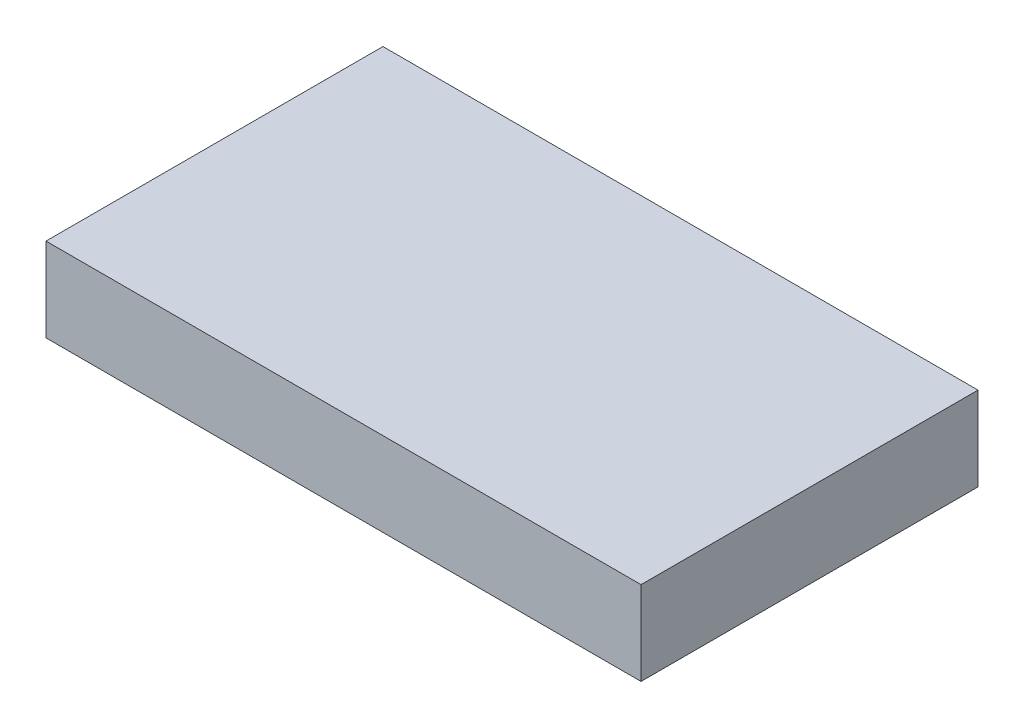
ISO-10303-21;
HEADER;
FILE_DESCRIPTION(('STEP AP214'),'2;1');
FILE_NAME('part.step','',(''),(''),'','','');
FILE_SCHEMA(('AUTOMOTIVE_DESIGN { 1 0 10303 214 1 1 1 1 }'));
ENDSEC;
DATA;
#1=APPLICATION_CONTEXT('core data for automotive mechanical design processes');
#2=APPLICATION_PROTOCOL_DEFINITION('international standard','automotive_design',2000,#1);
#3=PRODUCT_CONTEXT('',#1,'mechanical');
#4=PRODUCT('Part','Part','',(#3));
#5=PRODUCT_RELATED_PRODUCT_CATEGORY('part','',(#4));
#6=PRODUCT_DEFINITION_FORMATION('','',#4);
#7=PRODUCT_DEFINITION_CONTEXT('part definition',#1,'design');
#8=PRODUCT_DEFINITION('design','',#6,#7);
#9=PRODUCT_DEFINITION_SHAPE('','',#8);
#10=(LENGTH_UNIT() NAMED_UNIT(*) SI_UNIT(.MILLI.,.METRE.));
#11=(NAMED_UNIT(*) PLANE_ANGLE_UNIT() SI_UNIT($,.RADIAN.));
#12=(NAMED_UNIT(*) SI_UNIT($,.STERADIAN.) SOLID_ANGLE_UNIT());
#13=UNCERTAINTY_MEASURE_WITH_UNIT(LENGTH_MEASURE(1.E-05),#10,'distance_accuracy_value','');
#14=(GEOMETRIC_REPRESENTATION_CONTEXT(3) GLOBAL_UNCERTAINTY_ASSIGNED_CONTEXT((#13)) GLOBAL_UNIT_ASSIGNED_CONTEXT((#10,
#11,#12)) REPRESENTATION_CONTEXT('',''));
#15=CARTESIAN_POINT('',(0.,0.,0.));
#16=DIRECTION('',(0.,0.,1.));
#17=DIRECTION('',(1.,0.,0.));
#18=AXIS2_PLACEMENT_3D('',#15,#16,#17);
#19=CARTESIAN_POINT('',(37.325,10.52,21.135));
#20=DIRECTION('',(-1.,0.,0.));
#21=DIRECTION('',(0.,0.,1.));
#22=AXIS2_PLACEMENT_3D('',#19,#20,#21);
#23=PLANE('',#22);
#24=DIRECTION('',(0.,0.,-1.));
#25=VECTOR('',#24,1.);
#26=CARTESIAN_POINT('',(37.325,0.,21.135));
#27=LINE('',#26,#25);
#28=CARTESIAN_POINT('',(37.325,0.,21.135));
#29=VERTEX_POINT('',#28);
#30=CARTESIAN_POINT('',(37.325,0.,-21.135));
#31=VERTEX_POINT('',#30);
#32=EDGE_CURVE('E113',#29,#31,#27,.T.);
#33=ORIENTED_EDGE('',*,*,#32,.T.);
#34=DIRECTION('',(0.,-1.,0.));
#35=VECTOR('',#34,1.);
#36=CARTESIAN_POINT('',(37.325,10.52,-21.135));
#37=LINE('',#36,#35);
#38=CARTESIAN_POINT('',(37.325,10.52,-21.135));
#39=VERTEX_POINT('',#38);
#40=EDGE_CURVE('E11',#39,#31,#37,.T.);
#41=ORIENTED_EDGE('',*,*,#40,.F.);
#42=DIRECTION('',(0.,0.,-1.));
#43=VECTOR('',#42,1.);
#44=CARTESIAN_POINT('',(37.325,10.52,21.135));
#45=LINE('',#44,#43);
#46=CARTESIAN_POINT('',(37.325,10.52,21.135));
#47=VERTEX_POINT('',#46);
#48=EDGE_CURVE('E97',#47,#39,#45,.T.);
#49=ORIENTED_EDGE('',*,*,#48,.F.);
#50=DIRECTION('',(0.,-1.,0.));
#51=VECTOR('',#50,1.);
#52=CARTESIAN_POINT('',(37.325,10.52,21.135));
#53=LINE('',#52,#51);
#54=EDGE_CURVE('E109',#47,#29,#53,.T.);
#55=ORIENTED_EDGE('',*,*,#54,.T.);
#56=EDGE_LOOP('',(#33,#41,#49,#55));
#57=FACE_BOUND('',#56,.T.);
#58=ADVANCED_FACE('F45',(#57),#23,.F.);
#59=CARTESIAN_POINT('',(-37.325,10.52,-21.135));
#60=DIRECTION('',(0.,0.,1.));
#61=DIRECTION('',(1.,0.,0.));
#62=AXIS2_PLACEMENT_3D('',#59,#60,#61);
#63=PLANE('',#62);
#64=DIRECTION('',(-1.,0.,0.));
#65=VECTOR('',#64,1.);
#66=CARTESIAN_POINT('',(-37.325,0.,-21.135));
#67=LINE('',#66,#65);
#68=CARTESIAN_POINT('',(-37.325,0.,-21.135));
#69=VERTEX_POINT('',#68);
#70=EDGE_CURVE('E102',#31,#69,#67,.T.);
#71=ORIENTED_EDGE('',*,*,#70,.T.);
#72=DIRECTION('',(0.,-1.,0.));
#73=VECTOR('',#72,1.);
#74=CARTESIAN_POINT('',(-37.325,10.52,-21.135));
#75=LINE('',#74,#73);
#76=CARTESIAN_POINT('',(-37.325,10.52,-21.135));
#77=VERTEX_POINT('',#76);
#78=EDGE_CURVE('E54',#77,#69,#75,.T.);
#79=ORIENTED_EDGE('',*,*,#78,.F.);
#80=DIRECTION('',(-1.,0.,0.));
#81=VECTOR('',#80,1.);
#82=CARTESIAN_POINT('',(-37.325,10.52,-21.135));
#83=LINE('',#82,#81);
#84=EDGE_CURVE('E92',#39,#77,#83,.T.);
#85=ORIENTED_EDGE('',*,*,#84,.F.);
#86=ORIENTED_EDGE('',*,*,#40,.T.);
#87=EDGE_LOOP('',(#71,#79,#85,#86));
#88=FACE_BOUND('',#87,.T.);
#89=ADVANCED_FACE('F101',(#88),#63,.F.);
#90=CARTESIAN_POINT('',(-37.325,10.52,21.135));
#91=DIRECTION('',(1.,0.,0.));
#92=DIRECTION('',(0.,0.,-1.));
#93=AXIS2_PLACEMENT_3D('',#90,#91,#92);
#94=PLANE('',#93);
#95=DIRECTION('',(0.,0.,1.));
#96=VECTOR('',#95,1.);
#97=CARTESIAN_POINT('',(-37.325,0.,21.135));
#98=LINE('',#97,#96);
#99=CARTESIAN_POINT('',(-37.325,0.,21.135));
#100=VERTEX_POINT('',#99);
#101=EDGE_CURVE('E79',#69,#100,#98,.T.);
#102=ORIENTED_EDGE('',*,*,#101,.T.);
#103=DIRECTION('',(0.,-1.,0.));
#104=VECTOR('',#103,1.);
#105=CARTESIAN_POINT('',(-37.325,10.52,21.135));
#106=LINE('',#105,#104);
#107=CARTESIAN_POINT('',(-37.325,10.52,21.135));
#108=VERTEX_POINT('',#107);
#109=EDGE_CURVE('E104',#108,#100,#106,.T.);
#110=ORIENTED_EDGE('',*,*,#109,.F.);
#111=DIRECTION('',(0.,0.,1.));
#112=VECTOR('',#111,1.);
#113=CARTESIAN_POINT('',(-37.325,10.52,21.135));
#114=LINE('',#113,#112);
#115=EDGE_CURVE('E95',#77,#108,#114,.T.);
#116=ORIENTED_EDGE('',*,*,#115,.F.);
#117=ORIENTED_EDGE('',*,*,#78,.T.);
#118=EDGE_LOOP('',(#102,#110,#116,#117));
#119=FACE_BOUND('',#118,.T.);
#120=ADVANCED_FACE('F105',(#119),#94,.F.);
#121=CARTESIAN_POINT('',(-37.325,10.52,21.135));
#122=DIRECTION('',(0.,0.,-1.));
#123=DIRECTION('',(-1.,0.,0.));
#124=AXIS2_PLACEMENT_3D('',#121,#122,#123);
#125=PLANE('',#124);
#126=DIRECTION('',(1.,0.,0.));
#127=VECTOR('',#126,1.);
#128=CARTESIAN_POINT('',(-37.325,0.,21.135));
#129=LINE('',#128,#127);
#130=EDGE_CURVE('E85',#100,#29,#129,.T.);
#131=ORIENTED_EDGE('',*,*,#130,.T.);
#132=ORIENTED_EDGE('',*,*,#54,.F.);
#133=DIRECTION('',(1.,0.,0.));
#134=VECTOR('',#133,1.);
#135=CARTESIAN_POINT('',(-37.325,10.52,21.135));
#136=LINE('',#135,#134);
#137=EDGE_CURVE('E62',#108,#47,#136,.T.);
#138=ORIENTED_EDGE('',*,*,#137,.F.);
#139=ORIENTED_EDGE('',*,*,#109,.T.);
#140=EDGE_LOOP('',(#131,#132,#138,#139));
#141=FACE_BOUND('',#140,.T.);
#142=ADVANCED_FACE('F126',(#141),#125,.F.);
#143=CARTESIAN_POINT('',(0.,10.52,0.));
#144=DIRECTION('',(0.,-1.,0.));
#145=DIRECTION('',(0.,0.,-1.));
#146=AXIS2_PLACEMENT_3D('',#143,#144,#145);
#147=PLANE('',#146);
#148=ORIENTED_EDGE('',*,*,#48,.T.);
#149=ORIENTED_EDGE('',*,*,#84,.T.);
#150=ORIENTED_EDGE('',*,*,#115,.T.);
#151=ORIENTED_EDGE('',*,*,#137,.T.);
#152=EDGE_LOOP('',(#148,#149,#150,#151));
#153=FACE_BOUND('',#152,.T.);
#154=ADVANCED_FACE('F93',(#153),#147,.F.);
#155=CARTESIAN_POINT('',(0.,0.,0.));
#156=DIRECTION('',(0.,-1.,0.));
#157=DIRECTION('',(0.,0.,-1.));
#158=AXIS2_PLACEMENT_3D('',#155,#156,#157);
#159=PLANE('',#158);
#160=ORIENTED_EDGE('',*,*,#32,.F.);
#161=ORIENTED_EDGE('',*,*,#130,.F.);
#162=ORIENTED_EDGE('',*,*,#101,.F.);
#163=ORIENTED_EDGE('',*,*,#70,.F.);
#164=EDGE_LOOP('',(#160,#161,#162,#163));
#165=FACE_BOUND('',#164,.T.);
#166=ADVANCED_FACE('F129',(#165),#159,.T.);
#167=CLOSED_SHELL('',(#58,#89,#120,#142,#154,#166));
#168=MANIFOLD_SOLID_BREP('B2',#167);
#169=ADVANCED_BREP_SHAPE_REPRESENTATION('',(#18,#168),#14);
#170=SHAPE_DEFINITION_REPRESENTATION(#9,#169);
ENDSEC;
END-ISO-10303-21;
